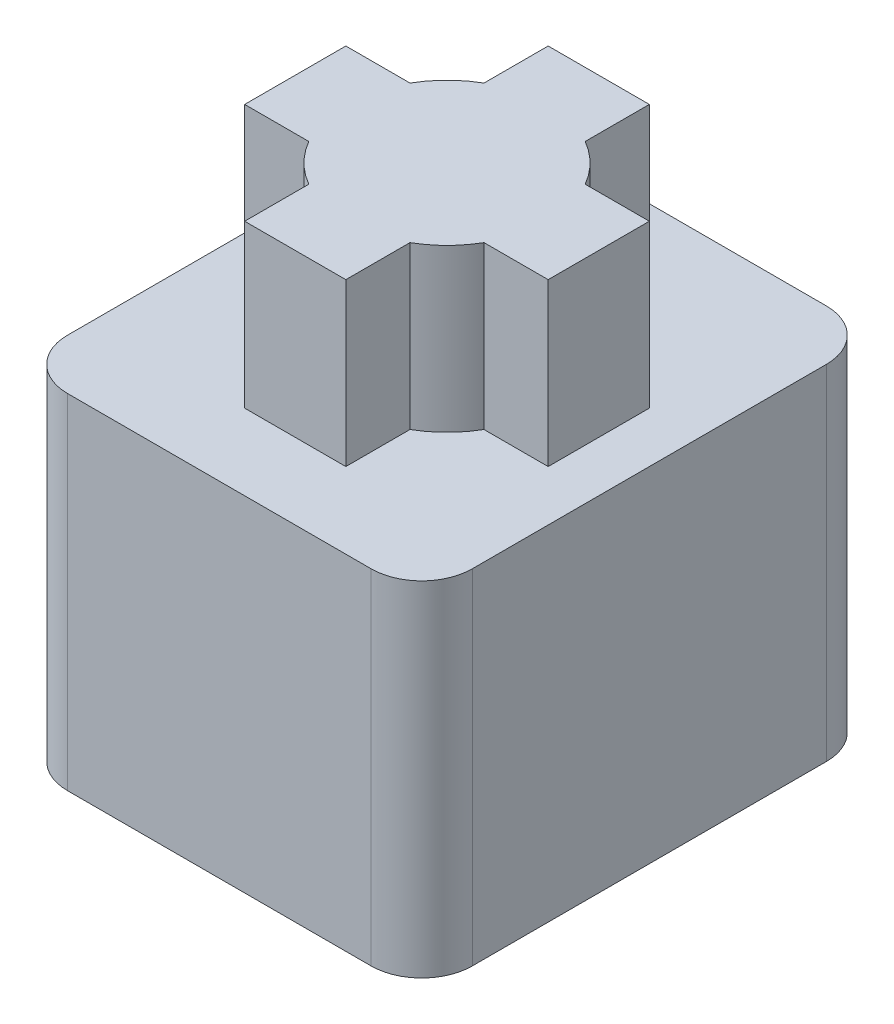
ISO-10303-21;
HEADER;
FILE_DESCRIPTION(('STEP AP214'),'2;1');
FILE_NAME('part.step','',(''),(''),'','','');
FILE_SCHEMA(('AUTOMOTIVE_DESIGN { 1 0 10303 214 1 1 1 1 }'));
ENDSEC;
DATA;
#1=APPLICATION_CONTEXT('core data for automotive mechanical design processes');
#2=APPLICATION_PROTOCOL_DEFINITION('international standard','automotive_design',2000,#1);
#3=PRODUCT_CONTEXT('',#1,'mechanical');
#4=PRODUCT('Part','Part','',(#3));
#5=PRODUCT_RELATED_PRODUCT_CATEGORY('part','',(#4));
#6=PRODUCT_DEFINITION_FORMATION('','',#4);
#7=PRODUCT_DEFINITION_CONTEXT('part definition',#1,'design');
#8=PRODUCT_DEFINITION('design','',#6,#7);
#9=PRODUCT_DEFINITION_SHAPE('','',#8);
#10=(LENGTH_UNIT() NAMED_UNIT(*) SI_UNIT(.MILLI.,.METRE.));
#11=(NAMED_UNIT(*) PLANE_ANGLE_UNIT() SI_UNIT($,.RADIAN.));
#12=(NAMED_UNIT(*) SI_UNIT($,.STERADIAN.) SOLID_ANGLE_UNIT());
#13=UNCERTAINTY_MEASURE_WITH_UNIT(LENGTH_MEASURE(1.E-05),#10,'distance_accuracy_value','');
#14=(GEOMETRIC_REPRESENTATION_CONTEXT(3) GLOBAL_UNCERTAINTY_ASSIGNED_CONTEXT((#13)) GLOBAL_UNIT_ASSIGNED_CONTEXT((#10,
#11,#12)) REPRESENTATION_CONTEXT('',''));
#15=CARTESIAN_POINT('',(0.,0.,0.));
#16=DIRECTION('',(0.,0.,1.));
#17=DIRECTION('',(1.,0.,0.));
#18=AXIS2_PLACEMENT_3D('',#15,#16,#17);
#19=CARTESIAN_POINT('',(0.,6.8,0.));
#20=DIRECTION('',(0.,-1.,0.));
#21=DIRECTION('',(0.,0.,-1.));
#22=AXIS2_PLACEMENT_3D('',#19,#20,#21);
#23=PLANE('',#22);
#24=DIRECTION('',(-1.,0.,0.));
#25=VECTOR('',#24,1.);
#26=CARTESIAN_POINT('',(0.,6.8,-9.));
#27=LINE('',#26,#25);
#28=CARTESIAN_POINT('',(7.,6.8,-9.));
#29=VERTEX_POINT('',#28);
#30=CARTESIAN_POINT('',(0.999999999999999,6.8,-9.));
#31=VERTEX_POINT('',#30);
#32=EDGE_CURVE('E336',#29,#31,#27,.T.);
#33=ORIENTED_EDGE('',*,*,#32,.T.);
#34=CARTESIAN_POINT('',(0.999999999999999,6.8,-8.));
#35=DIRECTION('',(0.,-1.,0.));
#36=DIRECTION('',(0.,0.,-1.));
#37=AXIS2_PLACEMENT_3D('',#34,#35,#36);
#38=CIRCLE('',#37,1.);
#39=CARTESIAN_POINT('',(0.,6.8,-8.));
#40=VERTEX_POINT('',#39);
#41=EDGE_CURVE('E372',#31,#40,#38,.F.);
#42=ORIENTED_EDGE('',*,*,#41,.T.);
#43=DIRECTION('',(0.,0.,1.));
#44=VECTOR('',#43,1.);
#45=CARTESIAN_POINT('',(0.,6.8,0.));
#46=LINE('',#45,#44);
#47=CARTESIAN_POINT('',(0.,6.8,-1.));
#48=VERTEX_POINT('',#47);
#49=EDGE_CURVE('E327',#40,#48,#46,.T.);
#50=ORIENTED_EDGE('',*,*,#49,.T.);
#51=CARTESIAN_POINT('',(1.,6.8,-1.));
#52=DIRECTION('',(0.,-1.,0.));
#53=DIRECTION('',(0.,0.,-1.));
#54=AXIS2_PLACEMENT_3D('',#51,#52,#53);
#55=CIRCLE('',#54,1.);
#56=CARTESIAN_POINT('',(1.,6.8,0.));
#57=VERTEX_POINT('',#56);
#58=EDGE_CURVE('E368',#48,#57,#55,.F.);
#59=ORIENTED_EDGE('',*,*,#58,.T.);
#60=DIRECTION('',(1.,0.,0.));
#61=VECTOR('',#60,1.);
#62=CARTESIAN_POINT('',(0.,6.8,0.));
#63=LINE('',#62,#61);
#64=CARTESIAN_POINT('',(7.,6.8,0.));
#65=VERTEX_POINT('',#64);
#66=EDGE_CURVE('E330',#57,#65,#63,.T.);
#67=ORIENTED_EDGE('',*,*,#66,.T.);
#68=CARTESIAN_POINT('',(7.,6.8,-1.));
#69=DIRECTION('',(0.,-1.,0.));
#70=DIRECTION('',(0.,0.,-1.));
#71=AXIS2_PLACEMENT_3D('',#68,#69,#70);
#72=CIRCLE('',#71,1.);
#73=CARTESIAN_POINT('',(8.,6.8,-1.));
#74=VERTEX_POINT('',#73);
#75=EDGE_CURVE('E366',#65,#74,#72,.F.);
#76=ORIENTED_EDGE('',*,*,#75,.T.);
#77=DIRECTION('',(0.,0.,-1.));
#78=VECTOR('',#77,1.);
#79=CARTESIAN_POINT('',(8.,6.8,0.));
#80=LINE('',#79,#78);
#81=CARTESIAN_POINT('',(8.,6.8,-8.));
#82=VERTEX_POINT('',#81);
#83=EDGE_CURVE('E334',#74,#82,#80,.T.);
#84=ORIENTED_EDGE('',*,*,#83,.T.);
#85=CARTESIAN_POINT('',(7.,6.8,-8.));
#86=DIRECTION('',(0.,-1.,0.));
#87=DIRECTION('',(0.,0.,-1.));
#88=AXIS2_PLACEMENT_3D('',#85,#86,#87);
#89=CIRCLE('',#88,1.);
#90=EDGE_CURVE('E370',#82,#29,#89,.F.);
#91=ORIENTED_EDGE('',*,*,#90,.T.);
#92=EDGE_LOOP('',(#33,#42,#50,#59,#67,#76,#84,#91));
#93=FACE_BOUND('',#92,.T.);
#94=CARTESIAN_POINT('',(4.,6.8,-4.5));
#95=DIRECTION('',(0.,1.,0.));
#96=DIRECTION('',(0.,0.,1.));
#97=AXIS2_PLACEMENT_3D('',#94,#95,#96);
#98=CIRCLE('',#97,2.);
#99=CARTESIAN_POINT('',(5.73205080756888,6.8,-5.5));
#100=VERTEX_POINT('',#99);
#101=CARTESIAN_POINT('',(5.,6.8,-6.23205080756888));
#102=VERTEX_POINT('',#101);
#103=EDGE_CURVE('E217',#100,#102,#98,.T.);
#104=ORIENTED_EDGE('',*,*,#103,.F.);
#105=DIRECTION('',(1.,0.,0.));
#106=VECTOR('',#105,1.);
#107=CARTESIAN_POINT('',(0.,6.8,-5.5));
#108=LINE('',#107,#106);
#109=CARTESIAN_POINT('',(7.,6.8,-5.5));
#110=VERTEX_POINT('',#109);
#111=EDGE_CURVE('E211',#100,#110,#108,.T.);
#112=ORIENTED_EDGE('',*,*,#111,.T.);
#113=DIRECTION('',(0.,0.,-1.));
#114=VECTOR('',#113,1.);
#115=CARTESIAN_POINT('',(7.,6.8,0.));
#116=LINE('',#115,#114);
#117=CARTESIAN_POINT('',(7.,6.8,-3.5));
#118=VERTEX_POINT('',#117);
#119=EDGE_CURVE('E50',#118,#110,#116,.T.);
#120=ORIENTED_EDGE('',*,*,#119,.F.);
#121=DIRECTION('',(1.,0.,0.));
#122=VECTOR('',#121,1.);
#123=CARTESIAN_POINT('',(0.,6.8,-3.5));
#124=LINE('',#123,#122);
#125=CARTESIAN_POINT('',(5.73205080756888,6.8,-3.5));
#126=VERTEX_POINT('',#125);
#127=EDGE_CURVE('E289',#126,#118,#124,.T.);
#128=ORIENTED_EDGE('',*,*,#127,.F.);
#129=CARTESIAN_POINT('',(4.,6.8,-4.5));
#130=DIRECTION('',(0.,1.,0.));
#131=DIRECTION('',(0.,0.,1.));
#132=AXIS2_PLACEMENT_3D('',#129,#130,#131);
#133=CIRCLE('',#132,2.);
#134=CARTESIAN_POINT('',(5.,6.8,-2.76794919243112));
#135=VERTEX_POINT('',#134);
#136=EDGE_CURVE('E287',#135,#126,#133,.T.);
#137=ORIENTED_EDGE('',*,*,#136,.F.);
#138=DIRECTION('',(0.,0.,1.));
#139=VECTOR('',#138,1.);
#140=CARTESIAN_POINT('',(5.,6.8,0.));
#141=LINE('',#140,#139);
#142=CARTESIAN_POINT('',(5.,6.8,-1.5));
#143=VERTEX_POINT('',#142);
#144=EDGE_CURVE('E284',#135,#143,#141,.T.);
#145=ORIENTED_EDGE('',*,*,#144,.T.);
#146=DIRECTION('',(1.,0.,0.));
#147=VECTOR('',#146,1.);
#148=CARTESIAN_POINT('',(0.,6.8,-1.5));
#149=LINE('',#148,#147);
#150=CARTESIAN_POINT('',(3.,6.8,-1.5));
#151=VERTEX_POINT('',#150);
#152=EDGE_CURVE('E281',#151,#143,#149,.T.);
#153=ORIENTED_EDGE('',*,*,#152,.F.);
#154=DIRECTION('',(0.,0.,1.));
#155=VECTOR('',#154,1.);
#156=CARTESIAN_POINT('',(3.,6.8,0.));
#157=LINE('',#156,#155);
#158=CARTESIAN_POINT('',(3.,6.8,-2.76794919243112));
#159=VERTEX_POINT('',#158);
#160=EDGE_CURVE('E279',#159,#151,#157,.T.);
#161=ORIENTED_EDGE('',*,*,#160,.F.);
#162=CARTESIAN_POINT('',(4.,6.8,-4.5));
#163=DIRECTION('',(0.,1.,0.));
#164=DIRECTION('',(0.,0.,1.));
#165=AXIS2_PLACEMENT_3D('',#162,#163,#164);
#166=CIRCLE('',#165,2.);
#167=CARTESIAN_POINT('',(2.26794919243112,6.8,-3.5));
#168=VERTEX_POINT('',#167);
#169=EDGE_CURVE('E277',#168,#159,#166,.T.);
#170=ORIENTED_EDGE('',*,*,#169,.F.);
#171=DIRECTION('',(1.,0.,0.));
#172=VECTOR('',#171,1.);
#173=CARTESIAN_POINT('',(0.,6.8,-3.5));
#174=LINE('',#173,#172);
#175=CARTESIAN_POINT('',(0.999999999999999,6.8,-3.5));
#176=VERTEX_POINT('',#175);
#177=EDGE_CURVE('E275',#176,#168,#174,.T.);
#178=ORIENTED_EDGE('',*,*,#177,.F.);
#179=DIRECTION('',(0.,0.,-1.));
#180=VECTOR('',#179,1.);
#181=CARTESIAN_POINT('',(0.999999999999999,6.8,0.));
#182=LINE('',#181,#180);
#183=CARTESIAN_POINT('',(0.999999999999999,6.8,-5.5));
#184=VERTEX_POINT('',#183);
#185=EDGE_CURVE('E272',#176,#184,#182,.T.);
#186=ORIENTED_EDGE('',*,*,#185,.T.);
#187=DIRECTION('',(1.,0.,0.));
#188=VECTOR('',#187,1.);
#189=CARTESIAN_POINT('',(0.,6.8,-5.5));
#190=LINE('',#189,#188);
#191=CARTESIAN_POINT('',(2.26794919243112,6.8,-5.5));
#192=VERTEX_POINT('',#191);
#193=EDGE_CURVE('E269',#184,#192,#190,.T.);
#194=ORIENTED_EDGE('',*,*,#193,.T.);
#195=CARTESIAN_POINT('',(4.,6.8,-4.5));
#196=DIRECTION('',(0.,1.,0.));
#197=DIRECTION('',(0.,0.,1.));
#198=AXIS2_PLACEMENT_3D('',#195,#196,#197);
#199=CIRCLE('',#198,2.);
#200=CARTESIAN_POINT('',(3.,6.8,-6.23205080756888));
#201=VERTEX_POINT('',#200);
#202=EDGE_CURVE('E266',#201,#192,#199,.T.);
#203=ORIENTED_EDGE('',*,*,#202,.F.);
#204=DIRECTION('',(0.,0.,1.));
#205=VECTOR('',#204,1.);
#206=CARTESIAN_POINT('',(3.,6.8,0.));
#207=LINE('',#206,#205);
#208=CARTESIAN_POINT('',(3.,6.8,-7.5));
#209=VERTEX_POINT('',#208);
#210=EDGE_CURVE('E264',#209,#201,#207,.T.);
#211=ORIENTED_EDGE('',*,*,#210,.F.);
#212=DIRECTION('',(1.,0.,0.));
#213=VECTOR('',#212,1.);
#214=CARTESIAN_POINT('',(0.,6.8,-7.5));
#215=LINE('',#214,#213);
#216=CARTESIAN_POINT('',(5.,6.8,-7.5));
#217=VERTEX_POINT('',#216);
#218=EDGE_CURVE('E261',#209,#217,#215,.T.);
#219=ORIENTED_EDGE('',*,*,#218,.T.);
#220=DIRECTION('',(0.,0.,1.));
#221=VECTOR('',#220,1.);
#222=CARTESIAN_POINT('',(5.,6.8,0.));
#223=LINE('',#222,#221);
#224=EDGE_CURVE('E259',#217,#102,#223,.T.);
#225=ORIENTED_EDGE('',*,*,#224,.T.);
#226=EDGE_LOOP('',(#104,#112,#120,#128,#137,#145,#153,#161,#170,#178,#186,#194,#203,#211,#219,#225));
#227=FACE_BOUND('',#226,.T.);
#228=ADVANCED_FACE('F35',(#93,#227),#23,.F.);
#229=CARTESIAN_POINT('',(0.,6.8,0.));
#230=DIRECTION('',(1.,0.,0.));
#231=DIRECTION('',(0.,0.,-1.));
#232=AXIS2_PLACEMENT_3D('',#229,#230,#231);
#233=PLANE('',#232);
#234=ORIENTED_EDGE('',*,*,#49,.F.);
#235=DIRECTION('',(0.,-1.,0.));
#236=VECTOR('',#235,1.);
#237=CARTESIAN_POINT('',(0.,6.8,-8.));
#238=LINE('',#237,#236);
#239=CARTESIAN_POINT('',(0.,0.,-8.));
#240=VERTEX_POINT('',#239);
#241=EDGE_CURVE('E350',#40,#240,#238,.T.);
#242=ORIENTED_EDGE('',*,*,#241,.T.);
#243=DIRECTION('',(0.,0.,1.));
#244=VECTOR('',#243,1.);
#245=CARTESIAN_POINT('',(0.,0.,0.));
#246=LINE('',#245,#244);
#247=CARTESIAN_POINT('',(0.,0.,-1.));
#248=VERTEX_POINT('',#247);
#249=EDGE_CURVE('E221',#240,#248,#246,.T.);
#250=ORIENTED_EDGE('',*,*,#249,.T.);
#251=DIRECTION('',(0.,-1.,0.));
#252=VECTOR('',#251,1.);
#253=CARTESIAN_POINT('',(0.,6.8,-1.));
#254=LINE('',#253,#252);
#255=EDGE_CURVE('E339',#248,#48,#254,.F.);
#256=ORIENTED_EDGE('',*,*,#255,.T.);
#257=EDGE_LOOP('',(#234,#242,#250,#256));
#258=FACE_BOUND('',#257,.T.);
#259=ADVANCED_FACE('F409',(#258),#233,.F.);
#260=CARTESIAN_POINT('',(0.,6.8,0.));
#261=DIRECTION('',(0.,0.,-1.));
#262=DIRECTION('',(-1.,0.,0.));
#263=AXIS2_PLACEMENT_3D('',#260,#261,#262);
#264=PLANE('',#263);
#265=ORIENTED_EDGE('',*,*,#66,.F.);
#266=DIRECTION('',(0.,-1.,0.));
#267=VECTOR('',#266,1.);
#268=CARTESIAN_POINT('',(1.,6.8,0.));
#269=LINE('',#268,#267);
#270=CARTESIAN_POINT('',(1.,0.,0.));
#271=VERTEX_POINT('',#270);
#272=EDGE_CURVE('E11',#57,#271,#269,.T.);
#273=ORIENTED_EDGE('',*,*,#272,.T.);
#274=DIRECTION('',(1.,0.,0.));
#275=VECTOR('',#274,1.);
#276=CARTESIAN_POINT('',(0.,0.,0.));
#277=LINE('',#276,#275);
#278=CARTESIAN_POINT('',(7.,0.,0.));
#279=VERTEX_POINT('',#278);
#280=EDGE_CURVE('E342',#271,#279,#277,.T.);
#281=ORIENTED_EDGE('',*,*,#280,.T.);
#282=DIRECTION('',(0.,-1.,0.));
#283=VECTOR('',#282,1.);
#284=CARTESIAN_POINT('',(7.,6.8,0.));
#285=LINE('',#284,#283);
#286=EDGE_CURVE('E43',#279,#65,#285,.F.);
#287=ORIENTED_EDGE('',*,*,#286,.T.);
#288=EDGE_LOOP('',(#265,#273,#281,#287));
#289=FACE_BOUND('',#288,.T.);
#290=ADVANCED_FACE('F380',(#289),#264,.F.);
#291=CARTESIAN_POINT('',(8.,6.8,0.));
#292=DIRECTION('',(-1.,0.,0.));
#293=DIRECTION('',(0.,0.,1.));
#294=AXIS2_PLACEMENT_3D('',#291,#292,#293);
#295=PLANE('',#294);
#296=DIRECTION('',(0.,0.,-1.));
#297=VECTOR('',#296,1.);
#298=CARTESIAN_POINT('',(8.,0.,0.));
#299=LINE('',#298,#297);
#300=CARTESIAN_POINT('',(8.,0.,-1.));
#301=VERTEX_POINT('',#300);
#302=CARTESIAN_POINT('',(8.,0.,-8.));
#303=VERTEX_POINT('',#302);
#304=EDGE_CURVE('E345',#301,#303,#299,.T.);
#305=ORIENTED_EDGE('',*,*,#304,.T.);
#306=DIRECTION('',(0.,-1.,0.));
#307=VECTOR('',#306,1.);
#308=CARTESIAN_POINT('',(8.,6.8,-8.));
#309=LINE('',#308,#307);
#310=EDGE_CURVE('E58',#303,#82,#309,.F.);
#311=ORIENTED_EDGE('',*,*,#310,.T.);
#312=ORIENTED_EDGE('',*,*,#83,.F.);
#313=DIRECTION('',(0.,-1.,0.));
#314=VECTOR('',#313,1.);
#315=CARTESIAN_POINT('',(8.,6.8,-1.));
#316=LINE('',#315,#314);
#317=EDGE_CURVE('E374',#74,#301,#316,.T.);
#318=ORIENTED_EDGE('',*,*,#317,.T.);
#319=EDGE_LOOP('',(#305,#311,#312,#318));
#320=FACE_BOUND('',#319,.T.);
#321=ADVANCED_FACE('F390',(#320),#295,.F.);
#322=CARTESIAN_POINT('',(0.,6.8,-9.));
#323=DIRECTION('',(0.,0.,1.));
#324=DIRECTION('',(1.,0.,0.));
#325=AXIS2_PLACEMENT_3D('',#322,#323,#324);
#326=PLANE('',#325);
#327=DIRECTION('',(-1.,0.,0.));
#328=VECTOR('',#327,1.);
#329=CARTESIAN_POINT('',(0.,0.,-9.));
#330=LINE('',#329,#328);
#331=CARTESIAN_POINT('',(7.,0.,-9.));
#332=VERTEX_POINT('',#331);
#333=CARTESIAN_POINT('',(0.999999999999999,0.,-9.));
#334=VERTEX_POINT('',#333);
#335=EDGE_CURVE('E331',#332,#334,#330,.T.);
#336=ORIENTED_EDGE('',*,*,#335,.T.);
#337=DIRECTION('',(0.,-1.,0.));
#338=VECTOR('',#337,1.);
#339=CARTESIAN_POINT('',(0.999999999999999,6.8,-9.));
#340=LINE('',#339,#338);
#341=EDGE_CURVE('E364',#334,#31,#340,.F.);
#342=ORIENTED_EDGE('',*,*,#341,.T.);
#343=ORIENTED_EDGE('',*,*,#32,.F.);
#344=DIRECTION('',(0.,-1.,0.));
#345=VECTOR('',#344,1.);
#346=CARTESIAN_POINT('',(7.,6.8,-9.));
#347=LINE('',#346,#345);
#348=EDGE_CURVE('E361',#29,#332,#347,.T.);
#349=ORIENTED_EDGE('',*,*,#348,.T.);
#350=EDGE_LOOP('',(#336,#342,#343,#349));
#351=FACE_BOUND('',#350,.T.);
#352=ADVANCED_FACE('F401',(#351),#326,.F.);
#353=CARTESIAN_POINT('',(0.,0.,0.));
#354=DIRECTION('',(0.,-1.,0.));
#355=DIRECTION('',(0.,0.,-1.));
#356=AXIS2_PLACEMENT_3D('',#353,#354,#355);
#357=PLANE('',#356);
#358=ORIENTED_EDGE('',*,*,#249,.F.);
#359=CARTESIAN_POINT('',(0.999999999999999,0.,-8.));
#360=DIRECTION('',(0.,-1.,0.));
#361=DIRECTION('',(0.,0.,-1.));
#362=AXIS2_PLACEMENT_3D('',#359,#360,#361);
#363=CIRCLE('',#362,1.);
#364=EDGE_CURVE('E359',#240,#334,#363,.T.);
#365=ORIENTED_EDGE('',*,*,#364,.T.);
#366=ORIENTED_EDGE('',*,*,#335,.F.);
#367=CARTESIAN_POINT('',(7.,0.,-8.));
#368=DIRECTION('',(0.,-1.,0.));
#369=DIRECTION('',(0.,0.,-1.));
#370=AXIS2_PLACEMENT_3D('',#367,#368,#369);
#371=CIRCLE('',#370,1.);
#372=EDGE_CURVE('E357',#332,#303,#371,.T.);
#373=ORIENTED_EDGE('',*,*,#372,.T.);
#374=ORIENTED_EDGE('',*,*,#304,.F.);
#375=CARTESIAN_POINT('',(7.,0.,-1.));
#376=DIRECTION('',(0.,-1.,0.));
#377=DIRECTION('',(0.,0.,-1.));
#378=AXIS2_PLACEMENT_3D('',#375,#376,#377);
#379=CIRCLE('',#378,1.);
#380=EDGE_CURVE('E353',#301,#279,#379,.T.);
#381=ORIENTED_EDGE('',*,*,#380,.T.);
#382=ORIENTED_EDGE('',*,*,#280,.F.);
#383=CARTESIAN_POINT('',(1.,0.,-1.));
#384=DIRECTION('',(0.,-1.,0.));
#385=DIRECTION('',(0.,0.,-1.));
#386=AXIS2_PLACEMENT_3D('',#383,#384,#385);
#387=CIRCLE('',#386,1.);
#388=EDGE_CURVE('E355',#271,#248,#387,.T.);
#389=ORIENTED_EDGE('',*,*,#388,.T.);
#390=EDGE_LOOP('',(#358,#365,#366,#373,#374,#381,#382,#389));
#391=FACE_BOUND('',#390,.T.);
#392=ADVANCED_FACE('F393',(#391),#357,.T.);
#393=CARTESIAN_POINT('',(0.999999999999999,6.8,-8.));
#394=DIRECTION('',(0.,-1.,0.));
#395=DIRECTION('',(0.,0.,-1.));
#396=AXIS2_PLACEMENT_3D('',#393,#394,#395);
#397=CYLINDRICAL_SURFACE('',#396,1.);
#398=ORIENTED_EDGE('',*,*,#41,.F.);
#399=ORIENTED_EDGE('',*,*,#341,.F.);
#400=ORIENTED_EDGE('',*,*,#364,.F.);
#401=ORIENTED_EDGE('',*,*,#241,.F.);
#402=EDGE_LOOP('',(#398,#399,#400,#401));
#403=FACE_BOUND('',#402,.T.);
#404=ADVANCED_FACE('F407',(#403),#397,.T.);
#405=CARTESIAN_POINT('',(7.,6.8,-8.));
#406=DIRECTION('',(0.,-1.,0.));
#407=DIRECTION('',(0.,0.,-1.));
#408=AXIS2_PLACEMENT_3D('',#405,#406,#407);
#409=CYLINDRICAL_SURFACE('',#408,1.);
#410=ORIENTED_EDGE('',*,*,#90,.F.);
#411=ORIENTED_EDGE('',*,*,#310,.F.);
#412=ORIENTED_EDGE('',*,*,#372,.F.);
#413=ORIENTED_EDGE('',*,*,#348,.F.);
#414=EDGE_LOOP('',(#410,#411,#412,#413));
#415=FACE_BOUND('',#414,.T.);
#416=ADVANCED_FACE('F398',(#415),#409,.T.);
#417=CARTESIAN_POINT('',(1.,6.8,-1.));
#418=DIRECTION('',(0.,-1.,0.));
#419=DIRECTION('',(0.,0.,-1.));
#420=AXIS2_PLACEMENT_3D('',#417,#418,#419);
#421=CYLINDRICAL_SURFACE('',#420,1.);
#422=ORIENTED_EDGE('',*,*,#58,.F.);
#423=ORIENTED_EDGE('',*,*,#255,.F.);
#424=ORIENTED_EDGE('',*,*,#388,.F.);
#425=ORIENTED_EDGE('',*,*,#272,.F.);
#426=EDGE_LOOP('',(#422,#423,#424,#425));
#427=FACE_BOUND('',#426,.T.);
#428=ADVANCED_FACE('F412',(#427),#421,.T.);
#429=CARTESIAN_POINT('',(7.,6.8,-1.));
#430=DIRECTION('',(0.,-1.,0.));
#431=DIRECTION('',(0.,0.,-1.));
#432=AXIS2_PLACEMENT_3D('',#429,#430,#431);
#433=CYLINDRICAL_SURFACE('',#432,1.);
#434=ORIENTED_EDGE('',*,*,#75,.F.);
#435=ORIENTED_EDGE('',*,*,#286,.F.);
#436=ORIENTED_EDGE('',*,*,#380,.F.);
#437=ORIENTED_EDGE('',*,*,#317,.F.);
#438=EDGE_LOOP('',(#434,#435,#436,#437));
#439=FACE_BOUND('',#438,.T.);
#440=ADVANCED_FACE('F37',(#439),#433,.T.);
#441=CARTESIAN_POINT('',(4.,10.,-4.5));
#442=DIRECTION('',(0.,-1.,0.));
#443=DIRECTION('',(0.,0.,-1.));
#444=AXIS2_PLACEMENT_3D('',#441,#442,#443);
#445=CYLINDRICAL_SURFACE('',#444,2.);
#446=ORIENTED_EDGE('',*,*,#103,.T.);
#447=DIRECTION('',(0.,-1.,0.));
#448=VECTOR('',#447,1.);
#449=CARTESIAN_POINT('',(5.,10.,-6.23205080756888));
#450=LINE('',#449,#448);
#451=CARTESIAN_POINT('',(5.,10.,-6.23205080756888));
#452=VERTEX_POINT('',#451);
#453=EDGE_CURVE('E214',#452,#102,#450,.T.);
#454=ORIENTED_EDGE('',*,*,#453,.F.);
#455=CARTESIAN_POINT('',(4.,10.,-4.5));
#456=DIRECTION('',(0.,1.,0.));
#457=DIRECTION('',(0.,0.,1.));
#458=AXIS2_PLACEMENT_3D('',#455,#456,#457);
#459=CIRCLE('',#458,2.);
#460=CARTESIAN_POINT('',(5.73205080756888,10.,-5.5));
#461=VERTEX_POINT('',#460);
#462=EDGE_CURVE('E201',#461,#452,#459,.T.);
#463=ORIENTED_EDGE('',*,*,#462,.F.);
#464=DIRECTION('',(0.,-1.,0.));
#465=VECTOR('',#464,1.);
#466=CARTESIAN_POINT('',(5.73205080756888,10.,-5.5));
#467=LINE('',#466,#465);
#468=EDGE_CURVE('E257',#461,#100,#467,.T.);
#469=ORIENTED_EDGE('',*,*,#468,.T.);
#470=EDGE_LOOP('',(#446,#454,#463,#469));
#471=FACE_BOUND('',#470,.T.);
#472=ADVANCED_FACE('F215',(#471),#445,.T.);
#473=CARTESIAN_POINT('',(5.,10.,0.));
#474=DIRECTION('',(1.,0.,0.));
#475=DIRECTION('',(0.,0.,-1.));
#476=AXIS2_PLACEMENT_3D('',#473,#474,#475);
#477=PLANE('',#476);
#478=ORIENTED_EDGE('',*,*,#224,.F.);
#479=DIRECTION('',(0.,-1.,0.));
#480=VECTOR('',#479,1.);
#481=CARTESIAN_POINT('',(5.,10.,-7.5));
#482=LINE('',#481,#480);
#483=CARTESIAN_POINT('',(5.,10.,-7.5));
#484=VERTEX_POINT('',#483);
#485=EDGE_CURVE('E222',#484,#217,#482,.T.);
#486=ORIENTED_EDGE('',*,*,#485,.F.);
#487=DIRECTION('',(0.,0.,1.));
#488=VECTOR('',#487,1.);
#489=CARTESIAN_POINT('',(5.,10.,0.));
#490=LINE('',#489,#488);
#491=EDGE_CURVE('E206',#484,#452,#490,.T.);
#492=ORIENTED_EDGE('',*,*,#491,.T.);
#493=ORIENTED_EDGE('',*,*,#453,.T.);
#494=EDGE_LOOP('',(#478,#486,#492,#493));
#495=FACE_BOUND('',#494,.T.);
#496=ADVANCED_FACE('F224',(#495),#477,.T.);
#497=CARTESIAN_POINT('',(0.,10.,-7.5));
#498=DIRECTION('',(0.,0.,-1.));
#499=DIRECTION('',(-1.,0.,0.));
#500=AXIS2_PLACEMENT_3D('',#497,#498,#499);
#501=PLANE('',#500);
#502=ORIENTED_EDGE('',*,*,#218,.F.);
#503=DIRECTION('',(0.,-1.,0.));
#504=VECTOR('',#503,1.);
#505=CARTESIAN_POINT('',(3.,10.,-7.5));
#506=LINE('',#505,#504);
#507=CARTESIAN_POINT('',(3.,10.,-7.5));
#508=VERTEX_POINT('',#507);
#509=EDGE_CURVE('E324',#508,#209,#506,.T.);
#510=ORIENTED_EDGE('',*,*,#509,.F.);
#511=DIRECTION('',(1.,0.,0.));
#512=VECTOR('',#511,1.);
#513=CARTESIAN_POINT('',(0.,10.,-7.5));
#514=LINE('',#513,#512);
#515=EDGE_CURVE('E225',#508,#484,#514,.T.);
#516=ORIENTED_EDGE('',*,*,#515,.T.);
#517=ORIENTED_EDGE('',*,*,#485,.T.);
#518=EDGE_LOOP('',(#502,#510,#516,#517));
#519=FACE_BOUND('',#518,.T.);
#520=ADVANCED_FACE('F475',(#519),#501,.T.);
#521=CARTESIAN_POINT('',(3.,10.,0.));
#522=DIRECTION('',(1.,0.,0.));
#523=DIRECTION('',(0.,0.,-1.));
#524=AXIS2_PLACEMENT_3D('',#521,#522,#523);
#525=PLANE('',#524);
#526=ORIENTED_EDGE('',*,*,#210,.T.);
#527=DIRECTION('',(0.,-1.,0.));
#528=VECTOR('',#527,1.);
#529=CARTESIAN_POINT('',(3.,10.,-6.23205080756888));
#530=LINE('',#529,#528);
#531=CARTESIAN_POINT('',(3.,10.,-6.23205080756888));
#532=VERTEX_POINT('',#531);
#533=EDGE_CURVE('E321',#532,#201,#530,.T.);
#534=ORIENTED_EDGE('',*,*,#533,.F.);
#535=DIRECTION('',(0.,0.,1.));
#536=VECTOR('',#535,1.);
#537=CARTESIAN_POINT('',(3.,10.,0.));
#538=LINE('',#537,#536);
#539=EDGE_CURVE('E227',#508,#532,#538,.T.);
#540=ORIENTED_EDGE('',*,*,#539,.F.);
#541=ORIENTED_EDGE('',*,*,#509,.T.);
#542=EDGE_LOOP('',(#526,#534,#540,#541));
#543=FACE_BOUND('',#542,.T.);
#544=ADVANCED_FACE('F483',(#543),#525,.F.);
#545=CARTESIAN_POINT('',(4.,10.,-4.5));
#546=DIRECTION('',(0.,-1.,0.));
#547=DIRECTION('',(0.,0.,-1.));
#548=AXIS2_PLACEMENT_3D('',#545,#546,#547);
#549=CYLINDRICAL_SURFACE('',#548,2.);
#550=ORIENTED_EDGE('',*,*,#202,.T.);
#551=DIRECTION('',(0.,-1.,0.));
#552=VECTOR('',#551,1.);
#553=CARTESIAN_POINT('',(2.26794919243112,10.,-5.5));
#554=LINE('',#553,#552);
#555=CARTESIAN_POINT('',(2.26794919243112,10.,-5.5));
#556=VERTEX_POINT('',#555);
#557=EDGE_CURVE('E319',#556,#192,#554,.T.);
#558=ORIENTED_EDGE('',*,*,#557,.F.);
#559=CARTESIAN_POINT('',(4.,10.,-4.5));
#560=DIRECTION('',(0.,1.,0.));
#561=DIRECTION('',(0.,0.,1.));
#562=AXIS2_PLACEMENT_3D('',#559,#560,#561);
#563=CIRCLE('',#562,2.);
#564=EDGE_CURVE('E231',#532,#556,#563,.T.);
#565=ORIENTED_EDGE('',*,*,#564,.F.);
#566=ORIENTED_EDGE('',*,*,#533,.T.);
#567=EDGE_LOOP('',(#550,#558,#565,#566));
#568=FACE_BOUND('',#567,.T.);
#569=ADVANCED_FACE('F493',(#568),#549,.T.);
#570=CARTESIAN_POINT('',(0.,10.,-5.5));
#571=DIRECTION('',(0.,0.,-1.));
#572=DIRECTION('',(-1.,0.,0.));
#573=AXIS2_PLACEMENT_3D('',#570,#571,#572);
#574=PLANE('',#573);
#575=ORIENTED_EDGE('',*,*,#193,.F.);
#576=DIRECTION('',(0.,-1.,0.));
#577=VECTOR('',#576,1.);
#578=CARTESIAN_POINT('',(0.999999999999999,10.,-5.5));
#579=LINE('',#578,#577);
#580=CARTESIAN_POINT('',(0.999999999999999,10.,-5.5));
#581=VERTEX_POINT('',#580);
#582=EDGE_CURVE('E317',#581,#184,#579,.T.);
#583=ORIENTED_EDGE('',*,*,#582,.F.);
#584=DIRECTION('',(1.,0.,0.));
#585=VECTOR('',#584,1.);
#586=CARTESIAN_POINT('',(0.,10.,-5.5));
#587=LINE('',#586,#585);
#588=EDGE_CURVE('E233',#581,#556,#587,.T.);
#589=ORIENTED_EDGE('',*,*,#588,.T.);
#590=ORIENTED_EDGE('',*,*,#557,.T.);
#591=EDGE_LOOP('',(#575,#583,#589,#590));
#592=FACE_BOUND('',#591,.T.);
#593=ADVANCED_FACE('F503',(#592),#574,.T.);
#594=CARTESIAN_POINT('',(0.999999999999999,10.,0.));
#595=DIRECTION('',(-1.,0.,0.));
#596=DIRECTION('',(0.,0.,1.));
#597=AXIS2_PLACEMENT_3D('',#594,#595,#596);
#598=PLANE('',#597);
#599=ORIENTED_EDGE('',*,*,#185,.F.);
#600=DIRECTION('',(0.,-1.,0.));
#601=VECTOR('',#600,1.);
#602=CARTESIAN_POINT('',(0.999999999999999,10.,-3.5));
#603=LINE('',#602,#601);
#604=CARTESIAN_POINT('',(0.999999999999999,10.,-3.5));
#605=VERTEX_POINT('',#604);
#606=EDGE_CURVE('E315',#605,#176,#603,.T.);
#607=ORIENTED_EDGE('',*,*,#606,.F.);
#608=DIRECTION('',(0.,0.,-1.));
#609=VECTOR('',#608,1.);
#610=CARTESIAN_POINT('',(0.999999999999999,10.,0.));
#611=LINE('',#610,#609);
#612=EDGE_CURVE('E236',#605,#581,#611,.T.);
#613=ORIENTED_EDGE('',*,*,#612,.T.);
#614=ORIENTED_EDGE('',*,*,#582,.T.);
#615=EDGE_LOOP('',(#599,#607,#613,#614));
#616=FACE_BOUND('',#615,.T.);
#617=ADVANCED_FACE('F513',(#616),#598,.T.);
#618=CARTESIAN_POINT('',(0.,10.,-3.5));
#619=DIRECTION('',(0.,0.,-1.));
#620=DIRECTION('',(-1.,0.,0.));
#621=AXIS2_PLACEMENT_3D('',#618,#619,#620);
#622=PLANE('',#621);
#623=ORIENTED_EDGE('',*,*,#177,.T.);
#624=DIRECTION('',(0.,-1.,0.));
#625=VECTOR('',#624,1.);
#626=CARTESIAN_POINT('',(2.26794919243112,10.,-3.5));
#627=LINE('',#626,#625);
#628=CARTESIAN_POINT('',(2.26794919243112,10.,-3.5));
#629=VERTEX_POINT('',#628);
#630=EDGE_CURVE('E312',#629,#168,#627,.T.);
#631=ORIENTED_EDGE('',*,*,#630,.F.);
#632=DIRECTION('',(1.,0.,0.));
#633=VECTOR('',#632,1.);
#634=CARTESIAN_POINT('',(0.,10.,-3.5));
#635=LINE('',#634,#633);
#636=EDGE_CURVE('E239',#605,#629,#635,.T.);
#637=ORIENTED_EDGE('',*,*,#636,.F.);
#638=ORIENTED_EDGE('',*,*,#606,.T.);
#639=EDGE_LOOP('',(#623,#631,#637,#638));
#640=FACE_BOUND('',#639,.T.);
#641=ADVANCED_FACE('F523',(#640),#622,.F.);
#642=CARTESIAN_POINT('',(4.,10.,-4.5));
#643=DIRECTION('',(0.,-1.,0.));
#644=DIRECTION('',(0.,0.,-1.));
#645=AXIS2_PLACEMENT_3D('',#642,#643,#644);
#646=CYLINDRICAL_SURFACE('',#645,2.);
#647=ORIENTED_EDGE('',*,*,#169,.T.);
#648=DIRECTION('',(0.,-1.,0.));
#649=VECTOR('',#648,1.);
#650=CARTESIAN_POINT('',(3.,10.,-2.76794919243112));
#651=LINE('',#650,#649);
#652=CARTESIAN_POINT('',(3.,10.,-2.76794919243112));
#653=VERTEX_POINT('',#652);
#654=EDGE_CURVE('E309',#653,#159,#651,.T.);
#655=ORIENTED_EDGE('',*,*,#654,.F.);
#656=CARTESIAN_POINT('',(4.,10.,-4.5));
#657=DIRECTION('',(0.,1.,0.));
#658=DIRECTION('',(0.,0.,1.));
#659=AXIS2_PLACEMENT_3D('',#656,#657,#658);
#660=CIRCLE('',#659,2.);
#661=EDGE_CURVE('E241',#629,#653,#660,.T.);
#662=ORIENTED_EDGE('',*,*,#661,.F.);
#663=ORIENTED_EDGE('',*,*,#630,.T.);
#664=EDGE_LOOP('',(#647,#655,#662,#663));
#665=FACE_BOUND('',#664,.T.);
#666=ADVANCED_FACE('F533',(#665),#646,.T.);
#667=CARTESIAN_POINT('',(3.,10.,0.));
#668=DIRECTION('',(1.,0.,0.));
#669=DIRECTION('',(0.,0.,-1.));
#670=AXIS2_PLACEMENT_3D('',#667,#668,#669);
#671=PLANE('',#670);
#672=ORIENTED_EDGE('',*,*,#160,.T.);
#673=DIRECTION('',(0.,-1.,0.));
#674=VECTOR('',#673,1.);
#675=CARTESIAN_POINT('',(3.,10.,-1.5));
#676=LINE('',#675,#674);
#677=CARTESIAN_POINT('',(3.,10.,-1.5));
#678=VERTEX_POINT('',#677);
#679=EDGE_CURVE('E306',#678,#151,#676,.T.);
#680=ORIENTED_EDGE('',*,*,#679,.F.);
#681=DIRECTION('',(0.,0.,1.));
#682=VECTOR('',#681,1.);
#683=CARTESIAN_POINT('',(3.,10.,0.));
#684=LINE('',#683,#682);
#685=EDGE_CURVE('E243',#653,#678,#684,.T.);
#686=ORIENTED_EDGE('',*,*,#685,.F.);
#687=ORIENTED_EDGE('',*,*,#654,.T.);
#688=EDGE_LOOP('',(#672,#680,#686,#687));
#689=FACE_BOUND('',#688,.T.);
#690=ADVANCED_FACE('F543',(#689),#671,.F.);
#691=CARTESIAN_POINT('',(0.,10.,-1.5));
#692=DIRECTION('',(0.,0.,-1.));
#693=DIRECTION('',(-1.,0.,0.));
#694=AXIS2_PLACEMENT_3D('',#691,#692,#693);
#695=PLANE('',#694);
#696=ORIENTED_EDGE('',*,*,#152,.T.);
#697=DIRECTION('',(0.,-1.,0.));
#698=VECTOR('',#697,1.);
#699=CARTESIAN_POINT('',(5.,10.,-1.5));
#700=LINE('',#699,#698);
#701=CARTESIAN_POINT('',(5.,10.,-1.5));
#702=VERTEX_POINT('',#701);
#703=EDGE_CURVE('E304',#702,#143,#700,.T.);
#704=ORIENTED_EDGE('',*,*,#703,.F.);
#705=DIRECTION('',(1.,0.,0.));
#706=VECTOR('',#705,1.);
#707=CARTESIAN_POINT('',(0.,10.,-1.5));
#708=LINE('',#707,#706);
#709=EDGE_CURVE('E245',#678,#702,#708,.T.);
#710=ORIENTED_EDGE('',*,*,#709,.F.);
#711=ORIENTED_EDGE('',*,*,#679,.T.);
#712=EDGE_LOOP('',(#696,#704,#710,#711));
#713=FACE_BOUND('',#712,.T.);
#714=ADVANCED_FACE('F553',(#713),#695,.F.);
#715=CARTESIAN_POINT('',(5.,10.,0.));
#716=DIRECTION('',(1.,0.,0.));
#717=DIRECTION('',(0.,0.,-1.));
#718=AXIS2_PLACEMENT_3D('',#715,#716,#717);
#719=PLANE('',#718);
#720=ORIENTED_EDGE('',*,*,#144,.F.);
#721=DIRECTION('',(0.,-1.,0.));
#722=VECTOR('',#721,1.);
#723=CARTESIAN_POINT('',(5.,10.,-2.76794919243112));
#724=LINE('',#723,#722);
#725=CARTESIAN_POINT('',(5.,10.,-2.76794919243112));
#726=VERTEX_POINT('',#725);
#727=EDGE_CURVE('E302',#726,#135,#724,.T.);
#728=ORIENTED_EDGE('',*,*,#727,.F.);
#729=DIRECTION('',(0.,0.,1.));
#730=VECTOR('',#729,1.);
#731=CARTESIAN_POINT('',(5.,10.,0.));
#732=LINE('',#731,#730);
#733=EDGE_CURVE('E247',#726,#702,#732,.T.);
#734=ORIENTED_EDGE('',*,*,#733,.T.);
#735=ORIENTED_EDGE('',*,*,#703,.T.);
#736=EDGE_LOOP('',(#720,#728,#734,#735));
#737=FACE_BOUND('',#736,.T.);
#738=ADVANCED_FACE('F563',(#737),#719,.T.);
#739=CARTESIAN_POINT('',(4.,10.,-4.5));
#740=DIRECTION('',(0.,-1.,0.));
#741=DIRECTION('',(0.,0.,-1.));
#742=AXIS2_PLACEMENT_3D('',#739,#740,#741);
#743=CYLINDRICAL_SURFACE('',#742,2.);
#744=ORIENTED_EDGE('',*,*,#136,.T.);
#745=DIRECTION('',(0.,-1.,0.));
#746=VECTOR('',#745,1.);
#747=CARTESIAN_POINT('',(5.73205080756888,10.,-3.5));
#748=LINE('',#747,#746);
#749=CARTESIAN_POINT('',(5.73205080756888,10.,-3.5));
#750=VERTEX_POINT('',#749);
#751=EDGE_CURVE('E299',#750,#126,#748,.T.);
#752=ORIENTED_EDGE('',*,*,#751,.F.);
#753=CARTESIAN_POINT('',(4.,10.,-4.5));
#754=DIRECTION('',(0.,1.,0.));
#755=DIRECTION('',(0.,0.,1.));
#756=AXIS2_PLACEMENT_3D('',#753,#754,#755);
#757=CIRCLE('',#756,2.);
#758=EDGE_CURVE('E250',#726,#750,#757,.T.);
#759=ORIENTED_EDGE('',*,*,#758,.F.);
#760=ORIENTED_EDGE('',*,*,#727,.T.);
#761=EDGE_LOOP('',(#744,#752,#759,#760));
#762=FACE_BOUND('',#761,.T.);
#763=ADVANCED_FACE('F573',(#762),#743,.T.);
#764=CARTESIAN_POINT('',(0.,10.,-3.5));
#765=DIRECTION('',(0.,0.,-1.));
#766=DIRECTION('',(-1.,0.,0.));
#767=AXIS2_PLACEMENT_3D('',#764,#765,#766);
#768=PLANE('',#767);
#769=ORIENTED_EDGE('',*,*,#127,.T.);
#770=DIRECTION('',(0.,-1.,0.));
#771=VECTOR('',#770,1.);
#772=CARTESIAN_POINT('',(7.,10.,-3.5));
#773=LINE('',#772,#771);
#774=CARTESIAN_POINT('',(7.,10.,-3.5));
#775=VERTEX_POINT('',#774);
#776=EDGE_CURVE('E297',#775,#118,#773,.T.);
#777=ORIENTED_EDGE('',*,*,#776,.F.);
#778=DIRECTION('',(1.,0.,0.));
#779=VECTOR('',#778,1.);
#780=CARTESIAN_POINT('',(0.,10.,-3.5));
#781=LINE('',#780,#779);
#782=EDGE_CURVE('E252',#750,#775,#781,.T.);
#783=ORIENTED_EDGE('',*,*,#782,.F.);
#784=ORIENTED_EDGE('',*,*,#751,.T.);
#785=EDGE_LOOP('',(#769,#777,#783,#784));
#786=FACE_BOUND('',#785,.T.);
#787=ADVANCED_FACE('F583',(#786),#768,.F.);
#788=CARTESIAN_POINT('',(7.,10.,0.));
#789=DIRECTION('',(-1.,0.,0.));
#790=DIRECTION('',(0.,0.,1.));
#791=AXIS2_PLACEMENT_3D('',#788,#789,#790);
#792=PLANE('',#791);
#793=ORIENTED_EDGE('',*,*,#119,.T.);
#794=DIRECTION('',(0.,-1.,0.));
#795=VECTOR('',#794,1.);
#796=CARTESIAN_POINT('',(7.,10.,-5.5));
#797=LINE('',#796,#795);
#798=CARTESIAN_POINT('',(7.,10.,-5.5));
#799=VERTEX_POINT('',#798);
#800=EDGE_CURVE('E295',#799,#110,#797,.T.);
#801=ORIENTED_EDGE('',*,*,#800,.F.);
#802=DIRECTION('',(0.,0.,-1.));
#803=VECTOR('',#802,1.);
#804=CARTESIAN_POINT('',(7.,10.,0.));
#805=LINE('',#804,#803);
#806=EDGE_CURVE('E254',#775,#799,#805,.T.);
#807=ORIENTED_EDGE('',*,*,#806,.F.);
#808=ORIENTED_EDGE('',*,*,#776,.T.);
#809=EDGE_LOOP('',(#793,#801,#807,#808));
#810=FACE_BOUND('',#809,.T.);
#811=ADVANCED_FACE('F593',(#810),#792,.F.);
#812=CARTESIAN_POINT('',(0.,10.,-5.5));
#813=DIRECTION('',(0.,0.,-1.));
#814=DIRECTION('',(-1.,0.,0.));
#815=AXIS2_PLACEMENT_3D('',#812,#813,#814);
#816=PLANE('',#815);
#817=ORIENTED_EDGE('',*,*,#111,.F.);
#818=ORIENTED_EDGE('',*,*,#468,.F.);
#819=DIRECTION('',(1.,0.,0.));
#820=VECTOR('',#819,1.);
#821=CARTESIAN_POINT('',(0.,10.,-5.5));
#822=LINE('',#821,#820);
#823=EDGE_CURVE('E209',#461,#799,#822,.T.);
#824=ORIENTED_EDGE('',*,*,#823,.T.);
#825=ORIENTED_EDGE('',*,*,#800,.T.);
#826=EDGE_LOOP('',(#817,#818,#824,#825));
#827=FACE_BOUND('',#826,.T.);
#828=ADVANCED_FACE('F603',(#827),#816,.T.);
#829=CARTESIAN_POINT('',(0.,10.,0.));
#830=DIRECTION('',(0.,1.,0.));
#831=DIRECTION('',(0.,0.,1.));
#832=AXIS2_PLACEMENT_3D('',#829,#830,#831);
#833=PLANE('',#832);
#834=ORIENTED_EDGE('',*,*,#462,.T.);
#835=ORIENTED_EDGE('',*,*,#491,.F.);
#836=ORIENTED_EDGE('',*,*,#515,.F.);
#837=ORIENTED_EDGE('',*,*,#539,.T.);
#838=ORIENTED_EDGE('',*,*,#564,.T.);
#839=ORIENTED_EDGE('',*,*,#588,.F.);
#840=ORIENTED_EDGE('',*,*,#612,.F.);
#841=ORIENTED_EDGE('',*,*,#636,.T.);
#842=ORIENTED_EDGE('',*,*,#661,.T.);
#843=ORIENTED_EDGE('',*,*,#685,.T.);
#844=ORIENTED_EDGE('',*,*,#709,.T.);
#845=ORIENTED_EDGE('',*,*,#733,.F.);
#846=ORIENTED_EDGE('',*,*,#758,.T.);
#847=ORIENTED_EDGE('',*,*,#782,.T.);
#848=ORIENTED_EDGE('',*,*,#806,.T.);
#849=ORIENTED_EDGE('',*,*,#823,.F.);
#850=EDGE_LOOP('',(#834,#835,#836,#837,#838,#839,#840,#841,#842,#843,#844,#845,#846,#847,#848,#849));
#851=FACE_BOUND('',#850,.T.);
#852=ADVANCED_FACE('F203',(#851),#833,.T.);
#853=CLOSED_SHELL('',(#228,#259,#290,#321,#352,#392,#404,#416,#428,#440,#472,#496,#520,#544,
#569,#593,#617,#641,#666,#690,#714,#738,#763,#787,#811,#828,#852));
#854=MANIFOLD_SOLID_BREP('B2',#853);
#855=ADVANCED_BREP_SHAPE_REPRESENTATION('',(#18,#854),#14);
#856=SHAPE_DEFINITION_REPRESENTATION(#9,#855);
ENDSEC;
END-ISO-10303-21;
